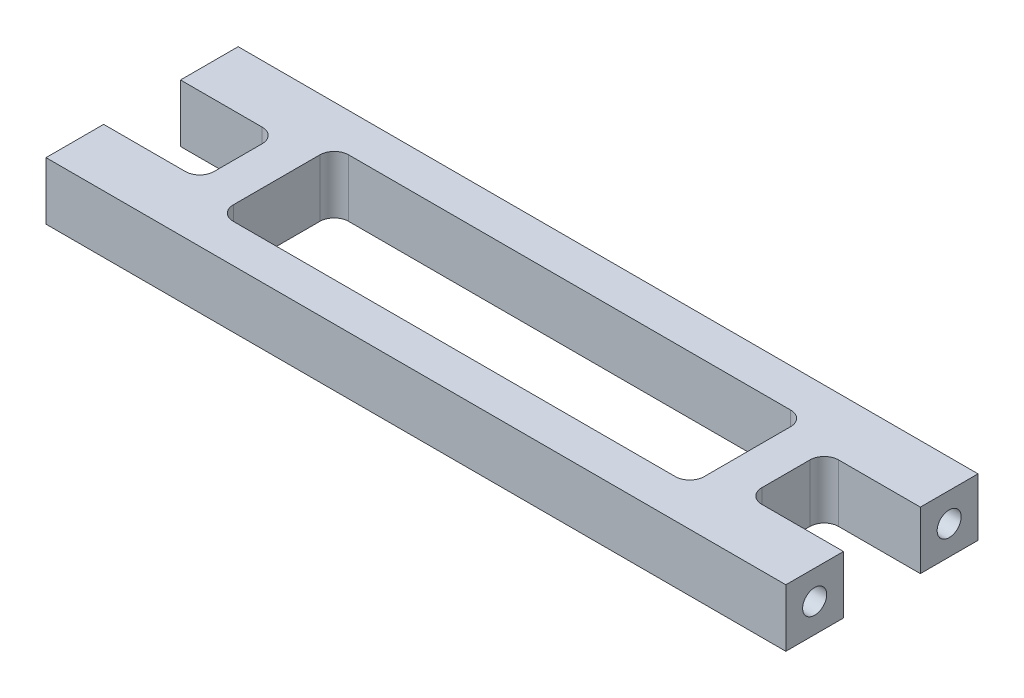
ISO-10303-21;
HEADER;
FILE_DESCRIPTION(('STEP AP214'),'2;1');
FILE_NAME('part.step','',(''),(''),'','','');
FILE_SCHEMA(('AUTOMOTIVE_DESIGN { 1 0 10303 214 1 1 1 1 }'));
ENDSEC;
DATA;
#1=APPLICATION_CONTEXT('core data for automotive mechanical design processes');
#2=APPLICATION_PROTOCOL_DEFINITION('international standard','automotive_design',2000,#1);
#3=PRODUCT_CONTEXT('',#1,'mechanical');
#4=PRODUCT('Part','Part','',(#3));
#5=PRODUCT_RELATED_PRODUCT_CATEGORY('part','',(#4));
#6=PRODUCT_DEFINITION_FORMATION('','',#4);
#7=PRODUCT_DEFINITION_CONTEXT('part definition',#1,'design');
#8=PRODUCT_DEFINITION('design','',#6,#7);
#9=PRODUCT_DEFINITION_SHAPE('','',#8);
#10=(LENGTH_UNIT() NAMED_UNIT(*) SI_UNIT(.MILLI.,.METRE.));
#11=(NAMED_UNIT(*) PLANE_ANGLE_UNIT() SI_UNIT($,.RADIAN.));
#12=(NAMED_UNIT(*) SI_UNIT($,.STERADIAN.) SOLID_ANGLE_UNIT());
#13=UNCERTAINTY_MEASURE_WITH_UNIT(LENGTH_MEASURE(1.E-05),#10,'distance_accuracy_value','');
#14=(GEOMETRIC_REPRESENTATION_CONTEXT(3) GLOBAL_UNCERTAINTY_ASSIGNED_CONTEXT((#13)) GLOBAL_UNIT_ASSIGNED_CONTEXT((#10,
#11,#12)) REPRESENTATION_CONTEXT('',''));
#15=CARTESIAN_POINT('',(0.,0.,0.));
#16=DIRECTION('',(0.,0.,1.));
#17=DIRECTION('',(1.,0.,0.));
#18=AXIS2_PLACEMENT_3D('',#15,#16,#17);
#19=CARTESIAN_POINT('',(77.,6.,0.));
#20=DIRECTION('',(-1.,0.,0.));
#21=DIRECTION('',(0.,0.,1.));
#22=AXIS2_PLACEMENT_3D('',#19,#20,#21);
#23=PLANE('',#22);
#24=CARTESIAN_POINT('',(77.,3.,-3.));
#25=DIRECTION('',(1.,0.,0.));
#26=DIRECTION('',(0.,0.,-1.));
#27=AXIS2_PLACEMENT_3D('',#24,#25,#26);
#28=CIRCLE('',#27,1.24999999999999);
#29=CARTESIAN_POINT('',(77.,3.,-4.24999999999999));
#30=VERTEX_POINT('',#29);
#31=EDGE_CURVE('E378',#30,#30,#28,.T.);
#32=ORIENTED_EDGE('',*,*,#31,.F.);
#33=EDGE_LOOP('',(#32));
#34=FACE_BOUND('',#33,.T.);
#35=DIRECTION('',(0.,0.,-1.));
#36=VECTOR('',#35,1.);
#37=CARTESIAN_POINT('',(77.,0.,0.));
#38=LINE('',#37,#36);
#39=CARTESIAN_POINT('',(77.,0.,0.));
#40=VERTEX_POINT('',#39);
#41=CARTESIAN_POINT('',(77.,0.,-6.));
#42=VERTEX_POINT('',#41);
#43=EDGE_CURVE('E213',#40,#42,#38,.T.);
#44=ORIENTED_EDGE('',*,*,#43,.T.);
#45=DIRECTION('',(0.,1.,0.));
#46=VECTOR('',#45,1.);
#47=CARTESIAN_POINT('',(77.,-0.00100000000000013,-6.));
#48=LINE('',#47,#46);
#49=CARTESIAN_POINT('',(77.,6.,-6.));
#50=VERTEX_POINT('',#49);
#51=EDGE_CURVE('E223',#42,#50,#48,.T.);
#52=ORIENTED_EDGE('',*,*,#51,.T.);
#53=DIRECTION('',(0.,0.,-1.));
#54=VECTOR('',#53,1.);
#55=CARTESIAN_POINT('',(77.,6.,0.));
#56=LINE('',#55,#54);
#57=CARTESIAN_POINT('',(77.,6.,0.));
#58=VERTEX_POINT('',#57);
#59=EDGE_CURVE('E409',#58,#50,#56,.T.);
#60=ORIENTED_EDGE('',*,*,#59,.F.);
#61=DIRECTION('',(0.,-1.,0.));
#62=VECTOR('',#61,1.);
#63=CARTESIAN_POINT('',(77.,6.,0.));
#64=LINE('',#63,#62);
#65=EDGE_CURVE('E235',#58,#40,#64,.T.);
#66=ORIENTED_EDGE('',*,*,#65,.T.);
#67=EDGE_LOOP('',(#44,#52,#60,#66));
#68=FACE_BOUND('',#67,.T.);
#69=ADVANCED_FACE('F33',(#34,#68),#23,.F.);
#70=CARTESIAN_POINT('',(0.,6.,0.));
#71=DIRECTION('',(1.,0.,0.));
#72=DIRECTION('',(0.,0.,-1.));
#73=AXIS2_PLACEMENT_3D('',#70,#71,#72);
#74=PLANE('',#73);
#75=CARTESIAN_POINT('',(0.,3.,-17.));
#76=DIRECTION('',(-1.,0.,0.));
#77=DIRECTION('',(0.,0.,1.));
#78=AXIS2_PLACEMENT_3D('',#75,#76,#77);
#79=CIRCLE('',#78,1.24999999999999);
#80=CARTESIAN_POINT('',(0.,3.,-15.75));
#81=VERTEX_POINT('',#80);
#82=EDGE_CURVE('E390',#81,#81,#79,.T.);
#83=ORIENTED_EDGE('',*,*,#82,.F.);
#84=EDGE_LOOP('',(#83));
#85=FACE_BOUND('',#84,.T.);
#86=DIRECTION('',(0.,0.,1.));
#87=VECTOR('',#86,1.);
#88=CARTESIAN_POINT('',(0.,0.,0.));
#89=LINE('',#88,#87);
#90=CARTESIAN_POINT('',(0.,0.,-20.));
#91=VERTEX_POINT('',#90);
#92=CARTESIAN_POINT('',(0.,0.,-14.));
#93=VERTEX_POINT('',#92);
#94=EDGE_CURVE('E411',#91,#93,#89,.T.);
#95=ORIENTED_EDGE('',*,*,#94,.T.);
#96=DIRECTION('',(0.,1.,0.));
#97=VECTOR('',#96,1.);
#98=CARTESIAN_POINT('',(0.,-0.00100000000000013,-14.));
#99=LINE('',#98,#97);
#100=CARTESIAN_POINT('',(0.,6.,-14.));
#101=VERTEX_POINT('',#100);
#102=EDGE_CURVE('E371',#93,#101,#99,.T.);
#103=ORIENTED_EDGE('',*,*,#102,.T.);
#104=DIRECTION('',(0.,0.,1.));
#105=VECTOR('',#104,1.);
#106=CARTESIAN_POINT('',(0.,6.,0.));
#107=LINE('',#106,#105);
#108=CARTESIAN_POINT('',(0.,6.,-20.));
#109=VERTEX_POINT('',#108);
#110=EDGE_CURVE('E403',#109,#101,#107,.T.);
#111=ORIENTED_EDGE('',*,*,#110,.F.);
#112=DIRECTION('',(0.,-1.,0.));
#113=VECTOR('',#112,1.);
#114=CARTESIAN_POINT('',(0.,6.,-20.));
#115=LINE('',#114,#113);
#116=EDGE_CURVE('E245',#109,#91,#115,.T.);
#117=ORIENTED_EDGE('',*,*,#116,.T.);
#118=EDGE_LOOP('',(#95,#103,#111,#117));
#119=FACE_BOUND('',#118,.T.);
#120=ADVANCED_FACE('F447',(#85,#119),#74,.F.);
#121=CARTESIAN_POINT('',(0.,3.,-3.));
#122=DIRECTION('',(-1.,0.,0.));
#123=DIRECTION('',(0.,0.,1.));
#124=AXIS2_PLACEMENT_3D('',#121,#122,#123);
#125=CIRCLE('',#124,1.24999999999999);
#126=CARTESIAN_POINT('',(0.,3.,-1.75000000000001));
#127=VERTEX_POINT('',#126);
#128=EDGE_CURVE('E396',#127,#127,#125,.T.);
#129=ORIENTED_EDGE('',*,*,#128,.F.);
#130=EDGE_LOOP('',(#129));
#131=FACE_BOUND('',#130,.T.);
#132=CARTESIAN_POINT('',(0.,6.,-6.));
#133=VERTEX_POINT('',#132);
#134=CARTESIAN_POINT('',(0.,6.,0.));
#135=VERTEX_POINT('',#134);
#136=EDGE_CURVE('E239',#133,#135,#107,.T.);
#137=ORIENTED_EDGE('',*,*,#136,.F.);
#138=DIRECTION('',(0.,1.,0.));
#139=VECTOR('',#138,1.);
#140=CARTESIAN_POINT('',(0.,-0.00100000000000013,-6.));
#141=LINE('',#140,#139);
#142=CARTESIAN_POINT('',(0.,0.,-6.));
#143=VERTEX_POINT('',#142);
#144=EDGE_CURVE('E370',#143,#133,#141,.T.);
#145=ORIENTED_EDGE('',*,*,#144,.F.);
#146=CARTESIAN_POINT('',(0.,0.,0.));
#147=VERTEX_POINT('',#146);
#148=EDGE_CURVE('E402',#143,#147,#89,.T.);
#149=ORIENTED_EDGE('',*,*,#148,.T.);
#150=DIRECTION('',(0.,-1.,0.));
#151=VECTOR('',#150,1.);
#152=CARTESIAN_POINT('',(0.,6.,0.));
#153=LINE('',#152,#151);
#154=EDGE_CURVE('E253',#135,#147,#153,.T.);
#155=ORIENTED_EDGE('',*,*,#154,.F.);
#156=EDGE_LOOP('',(#137,#145,#149,#155));
#157=FACE_BOUND('',#156,.T.);
#158=ADVANCED_FACE('F420',(#131,#157),#74,.F.);
#159=CARTESIAN_POINT('',(0.,6.,0.));
#160=DIRECTION('',(0.,0.,-1.));
#161=DIRECTION('',(-1.,0.,0.));
#162=AXIS2_PLACEMENT_3D('',#159,#160,#161);
#163=PLANE('',#162);
#164=DIRECTION('',(1.,0.,0.));
#165=VECTOR('',#164,1.);
#166=CARTESIAN_POINT('',(0.,0.,0.));
#167=LINE('',#166,#165);
#168=EDGE_CURVE('E241',#147,#40,#167,.T.);
#169=ORIENTED_EDGE('',*,*,#168,.T.);
#170=ORIENTED_EDGE('',*,*,#65,.F.);
#171=DIRECTION('',(1.,0.,0.));
#172=VECTOR('',#171,1.);
#173=CARTESIAN_POINT('',(0.,6.,0.));
#174=LINE('',#173,#172);
#175=EDGE_CURVE('E406',#135,#58,#174,.T.);
#176=ORIENTED_EDGE('',*,*,#175,.F.);
#177=ORIENTED_EDGE('',*,*,#154,.T.);
#178=EDGE_LOOP('',(#169,#170,#176,#177));
#179=FACE_BOUND('',#178,.T.);
#180=ADVANCED_FACE('F423',(#179),#163,.F.);
#181=CARTESIAN_POINT('',(77.,3.,-17.));
#182=DIRECTION('',(1.,0.,0.));
#183=DIRECTION('',(0.,0.,-1.));
#184=AXIS2_PLACEMENT_3D('',#181,#182,#183);
#185=CIRCLE('',#184,1.24999999999999);
#186=CARTESIAN_POINT('',(77.,3.,-18.25));
#187=VERTEX_POINT('',#186);
#188=EDGE_CURVE('E384',#187,#187,#185,.T.);
#189=ORIENTED_EDGE('',*,*,#188,.F.);
#190=EDGE_LOOP('',(#189));
#191=FACE_BOUND('',#190,.T.);
#192=CARTESIAN_POINT('',(77.,6.,-14.));
#193=VERTEX_POINT('',#192);
#194=CARTESIAN_POINT('',(77.,6.,-20.));
#195=VERTEX_POINT('',#194);
#196=EDGE_CURVE('E408',#193,#195,#56,.T.);
#197=ORIENTED_EDGE('',*,*,#196,.F.);
#198=DIRECTION('',(0.,1.,0.));
#199=VECTOR('',#198,1.);
#200=CARTESIAN_POINT('',(77.,-0.00100000000000013,-14.));
#201=LINE('',#200,#199);
#202=CARTESIAN_POINT('',(77.,0.,-14.));
#203=VERTEX_POINT('',#202);
#204=EDGE_CURVE('E231',#203,#193,#201,.T.);
#205=ORIENTED_EDGE('',*,*,#204,.F.);
#206=CARTESIAN_POINT('',(77.,0.,-20.));
#207=VERTEX_POINT('',#206);
#208=EDGE_CURVE('E237',#203,#207,#38,.T.);
#209=ORIENTED_EDGE('',*,*,#208,.T.);
#210=DIRECTION('',(0.,-1.,0.));
#211=VECTOR('',#210,1.);
#212=CARTESIAN_POINT('',(77.,6.,-20.));
#213=LINE('',#212,#211);
#214=EDGE_CURVE('E248',#195,#207,#213,.T.);
#215=ORIENTED_EDGE('',*,*,#214,.F.);
#216=EDGE_LOOP('',(#197,#205,#209,#215));
#217=FACE_BOUND('',#216,.T.);
#218=ADVANCED_FACE('F461',(#191,#217),#23,.F.);
#219=CARTESIAN_POINT('',(0.,6.,-20.));
#220=DIRECTION('',(0.,0.,1.));
#221=DIRECTION('',(1.,0.,0.));
#222=AXIS2_PLACEMENT_3D('',#219,#220,#221);
#223=PLANE('',#222);
#224=DIRECTION('',(-1.,0.,0.));
#225=VECTOR('',#224,1.);
#226=CARTESIAN_POINT('',(0.,0.,-20.));
#227=LINE('',#226,#225);
#228=EDGE_CURVE('E236',#207,#91,#227,.T.);
#229=ORIENTED_EDGE('',*,*,#228,.T.);
#230=ORIENTED_EDGE('',*,*,#116,.F.);
#231=DIRECTION('',(-1.,0.,0.));
#232=VECTOR('',#231,1.);
#233=CARTESIAN_POINT('',(0.,6.,-20.));
#234=LINE('',#233,#232);
#235=EDGE_CURVE('E249',#195,#109,#234,.T.);
#236=ORIENTED_EDGE('',*,*,#235,.F.);
#237=ORIENTED_EDGE('',*,*,#214,.T.);
#238=EDGE_LOOP('',(#229,#230,#236,#237));
#239=FACE_BOUND('',#238,.T.);
#240=ADVANCED_FACE('F454',(#239),#223,.F.);
#241=CARTESIAN_POINT('',(0.,6.,0.));
#242=DIRECTION('',(0.,-1.,0.));
#243=DIRECTION('',(0.,0.,-1.));
#244=AXIS2_PLACEMENT_3D('',#241,#242,#243);
#245=PLANE('',#244);
#246=DIRECTION('',(1.,0.,0.));
#247=VECTOR('',#246,1.);
#248=CARTESIAN_POINT('',(14.,6.,-4.));
#249=LINE('',#248,#247);
#250=CARTESIAN_POINT('',(15.5,6.,-4.));
#251=VERTEX_POINT('',#250);
#252=CARTESIAN_POINT('',(61.5,6.,-4.));
#253=VERTEX_POINT('',#252);
#254=EDGE_CURVE('E345',#251,#253,#249,.T.);
#255=ORIENTED_EDGE('',*,*,#254,.F.);
#256=CARTESIAN_POINT('',(15.5,6.,-5.5));
#257=DIRECTION('',(0.,-1.,0.));
#258=DIRECTION('',(0.,0.,-1.));
#259=AXIS2_PLACEMENT_3D('',#256,#257,#258);
#260=CIRCLE('',#259,1.5);
#261=CARTESIAN_POINT('',(14.,6.,-5.5));
#262=VERTEX_POINT('',#261);
#263=EDGE_CURVE('E305',#251,#262,#260,.T.);
#264=ORIENTED_EDGE('',*,*,#263,.T.);
#265=DIRECTION('',(0.,0.,1.));
#266=VECTOR('',#265,1.);
#267=CARTESIAN_POINT('',(14.,6.,-16.));
#268=LINE('',#267,#266);
#269=CARTESIAN_POINT('',(14.,6.,-14.5));
#270=VERTEX_POINT('',#269);
#271=EDGE_CURVE('E327',#270,#262,#268,.T.);
#272=ORIENTED_EDGE('',*,*,#271,.F.);
#273=CARTESIAN_POINT('',(15.5,6.,-14.5));
#274=DIRECTION('',(0.,-1.,0.));
#275=DIRECTION('',(0.,0.,-1.));
#276=AXIS2_PLACEMENT_3D('',#273,#274,#275);
#277=CIRCLE('',#276,1.5);
#278=CARTESIAN_POINT('',(15.5,6.,-16.));
#279=VERTEX_POINT('',#278);
#280=EDGE_CURVE('E41',#270,#279,#277,.T.);
#281=ORIENTED_EDGE('',*,*,#280,.T.);
#282=DIRECTION('',(-1.,0.,0.));
#283=VECTOR('',#282,1.);
#284=CARTESIAN_POINT('',(14.,6.,-16.));
#285=LINE('',#284,#283);
#286=CARTESIAN_POINT('',(61.5,6.,-16.));
#287=VERTEX_POINT('',#286);
#288=EDGE_CURVE('E325',#287,#279,#285,.T.);
#289=ORIENTED_EDGE('',*,*,#288,.F.);
#290=CARTESIAN_POINT('',(61.5,6.,-14.5));
#291=DIRECTION('',(0.,-1.,0.));
#292=DIRECTION('',(0.,0.,-1.));
#293=AXIS2_PLACEMENT_3D('',#290,#291,#292);
#294=CIRCLE('',#293,1.5);
#295=CARTESIAN_POINT('',(63.,6.,-14.5));
#296=VERTEX_POINT('',#295);
#297=EDGE_CURVE('E317',#287,#296,#294,.T.);
#298=ORIENTED_EDGE('',*,*,#297,.T.);
#299=DIRECTION('',(0.,0.,-1.));
#300=VECTOR('',#299,1.);
#301=CARTESIAN_POINT('',(63.,6.,-16.));
#302=LINE('',#301,#300);
#303=CARTESIAN_POINT('',(63.,6.,-5.5));
#304=VERTEX_POINT('',#303);
#305=EDGE_CURVE('E333',#304,#296,#302,.T.);
#306=ORIENTED_EDGE('',*,*,#305,.F.);
#307=CARTESIAN_POINT('',(61.5,6.,-5.5));
#308=DIRECTION('',(0.,-1.,0.));
#309=DIRECTION('',(0.,0.,-1.));
#310=AXIS2_PLACEMENT_3D('',#307,#308,#309);
#311=CIRCLE('',#310,1.5);
#312=EDGE_CURVE('E301',#304,#253,#311,.T.);
#313=ORIENTED_EDGE('',*,*,#312,.T.);
#314=EDGE_LOOP('',(#255,#264,#272,#281,#289,#298,#306,#313));
#315=FACE_BOUND('',#314,.T.);
#316=ORIENTED_EDGE('',*,*,#59,.T.);
#317=DIRECTION('',(1.,0.,0.));
#318=VECTOR('',#317,1.);
#319=CARTESIAN_POINT('',(77.,6.,-6.));
#320=LINE('',#319,#318);
#321=CARTESIAN_POINT('',(68.5,6.,-6.));
#322=VERTEX_POINT('',#321);
#323=EDGE_CURVE('E226',#322,#50,#320,.T.);
#324=ORIENTED_EDGE('',*,*,#323,.F.);
#325=CARTESIAN_POINT('',(68.5,6.,-7.5));
#326=DIRECTION('',(0.,-1.,0.));
#327=DIRECTION('',(0.,0.,-1.));
#328=AXIS2_PLACEMENT_3D('',#325,#326,#327);
#329=CIRCLE('',#328,1.5);
#330=CARTESIAN_POINT('',(67.,6.,-7.5));
#331=VERTEX_POINT('',#330);
#332=EDGE_CURVE('E294',#322,#331,#329,.T.);
#333=ORIENTED_EDGE('',*,*,#332,.T.);
#334=DIRECTION('',(0.,0.,1.));
#335=VECTOR('',#334,1.);
#336=CARTESIAN_POINT('',(67.,6.,-14.));
#337=LINE('',#336,#335);
#338=CARTESIAN_POINT('',(67.,6.,-12.5));
#339=VERTEX_POINT('',#338);
#340=EDGE_CURVE('E465',#339,#331,#337,.T.);
#341=ORIENTED_EDGE('',*,*,#340,.F.);
#342=CARTESIAN_POINT('',(68.5,6.,-12.5));
#343=DIRECTION('',(0.,-1.,0.));
#344=DIRECTION('',(0.,0.,-1.));
#345=AXIS2_PLACEMENT_3D('',#342,#343,#344);
#346=CIRCLE('',#345,1.5);
#347=CARTESIAN_POINT('',(68.5,6.,-14.));
#348=VERTEX_POINT('',#347);
#349=EDGE_CURVE('E297',#339,#348,#346,.T.);
#350=ORIENTED_EDGE('',*,*,#349,.T.);
#351=DIRECTION('',(-1.,0.,0.));
#352=VECTOR('',#351,1.);
#353=CARTESIAN_POINT('',(77.,6.,-14.));
#354=LINE('',#353,#352);
#355=EDGE_CURVE('E219',#193,#348,#354,.T.);
#356=ORIENTED_EDGE('',*,*,#355,.F.);
#357=ORIENTED_EDGE('',*,*,#196,.T.);
#358=ORIENTED_EDGE('',*,*,#235,.T.);
#359=ORIENTED_EDGE('',*,*,#110,.T.);
#360=DIRECTION('',(-1.,0.,0.));
#361=VECTOR('',#360,1.);
#362=CARTESIAN_POINT('',(0.,6.,-14.));
#363=LINE('',#362,#361);
#364=CARTESIAN_POINT('',(8.5,6.,-14.));
#365=VERTEX_POINT('',#364);
#366=EDGE_CURVE('E368',#365,#101,#363,.T.);
#367=ORIENTED_EDGE('',*,*,#366,.F.);
#368=CARTESIAN_POINT('',(8.5,6.,-12.5));
#369=DIRECTION('',(0.,-1.,0.));
#370=DIRECTION('',(0.,0.,-1.));
#371=AXIS2_PLACEMENT_3D('',#368,#369,#370);
#372=CIRCLE('',#371,1.5);
#373=CARTESIAN_POINT('',(10.,6.,-12.5));
#374=VERTEX_POINT('',#373);
#375=EDGE_CURVE('E313',#365,#374,#372,.T.);
#376=ORIENTED_EDGE('',*,*,#375,.T.);
#377=DIRECTION('',(0.,0.,-1.));
#378=VECTOR('',#377,1.);
#379=CARTESIAN_POINT('',(10.,6.,-14.));
#380=LINE('',#379,#378);
#381=CARTESIAN_POINT('',(10.,6.,-7.5));
#382=VERTEX_POINT('',#381);
#383=EDGE_CURVE('E365',#382,#374,#380,.T.);
#384=ORIENTED_EDGE('',*,*,#383,.F.);
#385=CARTESIAN_POINT('',(8.5,6.,-7.5));
#386=DIRECTION('',(0.,-1.,0.));
#387=DIRECTION('',(0.,0.,-1.));
#388=AXIS2_PLACEMENT_3D('',#385,#386,#387);
#389=CIRCLE('',#388,1.5);
#390=CARTESIAN_POINT('',(8.5,6.,-6.));
#391=VERTEX_POINT('',#390);
#392=EDGE_CURVE('E309',#382,#391,#389,.T.);
#393=ORIENTED_EDGE('',*,*,#392,.T.);
#394=DIRECTION('',(1.,0.,0.));
#395=VECTOR('',#394,1.);
#396=CARTESIAN_POINT('',(0.,6.,-6.));
#397=LINE('',#396,#395);
#398=EDGE_CURVE('E362',#133,#391,#397,.T.);
#399=ORIENTED_EDGE('',*,*,#398,.F.);
#400=ORIENTED_EDGE('',*,*,#136,.T.);
#401=ORIENTED_EDGE('',*,*,#175,.T.);
#402=EDGE_LOOP('',(#316,#324,#333,#341,#350,#356,#357,#358,#359,#367,#376,#384,#393,#399,#400,#401));
#403=FACE_BOUND('',#402,.T.);
#404=ADVANCED_FACE('F323',(#315,#403),#245,.F.);
#405=CARTESIAN_POINT('',(0.,0.,0.));
#406=DIRECTION('',(0.,-1.,0.));
#407=DIRECTION('',(0.,0.,-1.));
#408=AXIS2_PLACEMENT_3D('',#405,#406,#407);
#409=PLANE('',#408);
#410=DIRECTION('',(0.,0.,1.));
#411=VECTOR('',#410,1.);
#412=CARTESIAN_POINT('',(67.,0.,-14.));
#413=LINE('',#412,#411);
#414=CARTESIAN_POINT('',(67.,0.,-12.5));
#415=VERTEX_POINT('',#414);
#416=CARTESIAN_POINT('',(67.,0.,-7.5));
#417=VERTEX_POINT('',#416);
#418=EDGE_CURVE('E220',#415,#417,#413,.T.);
#419=ORIENTED_EDGE('',*,*,#418,.T.);
#420=CARTESIAN_POINT('',(68.5,0.,-7.5));
#421=DIRECTION('',(0.,-1.,0.));
#422=DIRECTION('',(0.,0.,-1.));
#423=AXIS2_PLACEMENT_3D('',#420,#421,#422);
#424=CIRCLE('',#423,1.5);
#425=CARTESIAN_POINT('',(68.5,0.,-6.));
#426=VERTEX_POINT('',#425);
#427=EDGE_CURVE('E215',#417,#426,#424,.F.);
#428=ORIENTED_EDGE('',*,*,#427,.T.);
#429=DIRECTION('',(1.,0.,0.));
#430=VECTOR('',#429,1.);
#431=CARTESIAN_POINT('',(77.,0.,-6.));
#432=LINE('',#431,#430);
#433=EDGE_CURVE('E207',#426,#42,#432,.T.);
#434=ORIENTED_EDGE('',*,*,#433,.T.);
#435=ORIENTED_EDGE('',*,*,#43,.F.);
#436=ORIENTED_EDGE('',*,*,#168,.F.);
#437=ORIENTED_EDGE('',*,*,#148,.F.);
#438=DIRECTION('',(1.,0.,0.));
#439=VECTOR('',#438,1.);
#440=CARTESIAN_POINT('',(0.,0.,-6.));
#441=LINE('',#440,#439);
#442=CARTESIAN_POINT('',(8.5,0.,-6.));
#443=VERTEX_POINT('',#442);
#444=EDGE_CURVE('E374',#143,#443,#441,.T.);
#445=ORIENTED_EDGE('',*,*,#444,.T.);
#446=CARTESIAN_POINT('',(8.5,0.,-7.5));
#447=DIRECTION('',(0.,-1.,0.));
#448=DIRECTION('',(0.,0.,-1.));
#449=AXIS2_PLACEMENT_3D('',#446,#447,#448);
#450=CIRCLE('',#449,1.5);
#451=CARTESIAN_POINT('',(10.,0.,-7.5));
#452=VERTEX_POINT('',#451);
#453=EDGE_CURVE('E311',#443,#452,#450,.F.);
#454=ORIENTED_EDGE('',*,*,#453,.T.);
#455=DIRECTION('',(0.,0.,-1.));
#456=VECTOR('',#455,1.);
#457=CARTESIAN_POINT('',(10.,0.,-14.));
#458=LINE('',#457,#456);
#459=CARTESIAN_POINT('',(10.,0.,-12.5));
#460=VERTEX_POINT('',#459);
#461=EDGE_CURVE('E357',#452,#460,#458,.T.);
#462=ORIENTED_EDGE('',*,*,#461,.T.);
#463=CARTESIAN_POINT('',(8.5,0.,-12.5));
#464=DIRECTION('',(0.,-1.,0.));
#465=DIRECTION('',(0.,0.,-1.));
#466=AXIS2_PLACEMENT_3D('',#463,#464,#465);
#467=CIRCLE('',#466,1.5);
#468=CARTESIAN_POINT('',(8.5,0.,-14.));
#469=VERTEX_POINT('',#468);
#470=EDGE_CURVE('E315',#460,#469,#467,.F.);
#471=ORIENTED_EDGE('',*,*,#470,.T.);
#472=DIRECTION('',(-1.,0.,0.));
#473=VECTOR('',#472,1.);
#474=CARTESIAN_POINT('',(0.,0.,-14.));
#475=LINE('',#474,#473);
#476=EDGE_CURVE('E360',#469,#93,#475,.T.);
#477=ORIENTED_EDGE('',*,*,#476,.T.);
#478=ORIENTED_EDGE('',*,*,#94,.F.);
#479=ORIENTED_EDGE('',*,*,#228,.F.);
#480=ORIENTED_EDGE('',*,*,#208,.F.);
#481=DIRECTION('',(-1.,0.,0.));
#482=VECTOR('',#481,1.);
#483=CARTESIAN_POINT('',(77.,0.,-14.));
#484=LINE('',#483,#482);
#485=CARTESIAN_POINT('',(68.5,0.,-14.));
#486=VERTEX_POINT('',#485);
#487=EDGE_CURVE('E230',#203,#486,#484,.T.);
#488=ORIENTED_EDGE('',*,*,#487,.T.);
#489=CARTESIAN_POINT('',(68.5,0.,-12.5));
#490=DIRECTION('',(0.,-1.,0.));
#491=DIRECTION('',(0.,0.,-1.));
#492=AXIS2_PLACEMENT_3D('',#489,#490,#491);
#493=CIRCLE('',#492,1.5);
#494=EDGE_CURVE('E299',#486,#415,#493,.F.);
#495=ORIENTED_EDGE('',*,*,#494,.T.);
#496=EDGE_LOOP('',(#419,#428,#434,#435,#436,#437,#445,#454,#462,#471,#477,#478,#479,#480,#488,#495));
#497=FACE_BOUND('',#496,.T.);
#498=DIRECTION('',(-1.,0.,0.));
#499=VECTOR('',#498,1.);
#500=CARTESIAN_POINT('',(14.,0.,-16.));
#501=LINE('',#500,#499);
#502=CARTESIAN_POINT('',(61.5,0.,-16.));
#503=VERTEX_POINT('',#502);
#504=CARTESIAN_POINT('',(15.5,0.,-16.));
#505=VERTEX_POINT('',#504);
#506=EDGE_CURVE('E340',#503,#505,#501,.T.);
#507=ORIENTED_EDGE('',*,*,#506,.T.);
#508=CARTESIAN_POINT('',(15.5,0.,-14.5));
#509=DIRECTION('',(0.,-1.,0.));
#510=DIRECTION('',(0.,0.,-1.));
#511=AXIS2_PLACEMENT_3D('',#508,#509,#510);
#512=CIRCLE('',#511,1.5);
#513=CARTESIAN_POINT('',(14.,0.,-14.5));
#514=VERTEX_POINT('',#513);
#515=EDGE_CURVE('E11',#505,#514,#512,.F.);
#516=ORIENTED_EDGE('',*,*,#515,.T.);
#517=DIRECTION('',(0.,0.,1.));
#518=VECTOR('',#517,1.);
#519=CARTESIAN_POINT('',(14.,0.,-16.));
#520=LINE('',#519,#518);
#521=CARTESIAN_POINT('',(14.,0.,-5.5));
#522=VERTEX_POINT('',#521);
#523=EDGE_CURVE('E338',#514,#522,#520,.T.);
#524=ORIENTED_EDGE('',*,*,#523,.T.);
#525=CARTESIAN_POINT('',(15.5,0.,-5.5));
#526=DIRECTION('',(0.,-1.,0.));
#527=DIRECTION('',(0.,0.,-1.));
#528=AXIS2_PLACEMENT_3D('',#525,#526,#527);
#529=CIRCLE('',#528,1.5);
#530=CARTESIAN_POINT('',(15.5,0.,-4.));
#531=VERTEX_POINT('',#530);
#532=EDGE_CURVE('E307',#522,#531,#529,.F.);
#533=ORIENTED_EDGE('',*,*,#532,.T.);
#534=DIRECTION('',(1.,0.,0.));
#535=VECTOR('',#534,1.);
#536=CARTESIAN_POINT('',(14.,0.,-4.));
#537=LINE('',#536,#535);
#538=CARTESIAN_POINT('',(61.5,0.,-4.));
#539=VERTEX_POINT('',#538);
#540=EDGE_CURVE('E332',#531,#539,#537,.T.);
#541=ORIENTED_EDGE('',*,*,#540,.T.);
#542=CARTESIAN_POINT('',(61.5,0.,-5.5));
#543=DIRECTION('',(0.,-1.,0.));
#544=DIRECTION('',(0.,0.,-1.));
#545=AXIS2_PLACEMENT_3D('',#542,#543,#544);
#546=CIRCLE('',#545,1.5);
#547=CARTESIAN_POINT('',(63.,0.,-5.5));
#548=VERTEX_POINT('',#547);
#549=EDGE_CURVE('E303',#539,#548,#546,.F.);
#550=ORIENTED_EDGE('',*,*,#549,.T.);
#551=DIRECTION('',(0.,0.,-1.));
#552=VECTOR('',#551,1.);
#553=CARTESIAN_POINT('',(63.,0.,-16.));
#554=LINE('',#553,#552);
#555=CARTESIAN_POINT('',(63.,0.,-14.5));
#556=VERTEX_POINT('',#555);
#557=EDGE_CURVE('E347',#548,#556,#554,.T.);
#558=ORIENTED_EDGE('',*,*,#557,.T.);
#559=CARTESIAN_POINT('',(61.5,0.,-14.5));
#560=DIRECTION('',(0.,-1.,0.));
#561=DIRECTION('',(0.,0.,-1.));
#562=AXIS2_PLACEMENT_3D('',#559,#560,#561);
#563=CIRCLE('',#562,1.5);
#564=EDGE_CURVE('E55',#556,#503,#563,.F.);
#565=ORIENTED_EDGE('',*,*,#564,.T.);
#566=EDGE_LOOP('',(#507,#516,#524,#533,#541,#550,#558,#565));
#567=FACE_BOUND('',#566,.T.);
#568=ADVANCED_FACE('F210',(#497,#567),#409,.T.);
#569=CARTESIAN_POINT('',(9.99999999999999,3.,-3.));
#570=DIRECTION('',(-1.,0.,0.));
#571=DIRECTION('',(0.,0.,1.));
#572=AXIS2_PLACEMENT_3D('',#569,#570,#571);
#573=CONICAL_SURFACE('',#572,1.24999999999999,1.02974425867665);
#574=CARTESIAN_POINT('',(10.7510757737844,3.,-3.));
#575=VERTEX_POINT('',#574);
#576=VERTEX_LOOP('',#575);
#577=FACE_BOUND('',#576,.T.);
#578=CARTESIAN_POINT('',(9.99999999999999,3.,-3.));
#579=DIRECTION('',(-1.,0.,0.));
#580=DIRECTION('',(0.,0.,1.));
#581=AXIS2_PLACEMENT_3D('',#578,#579,#580);
#582=CIRCLE('',#581,1.24999999999999);
#583=CARTESIAN_POINT('',(9.99999999999999,3.,-1.75000000000001));
#584=VERTEX_POINT('',#583);
#585=EDGE_CURVE('E399',#584,#584,#582,.T.);
#586=ORIENTED_EDGE('',*,*,#585,.T.);
#587=EDGE_LOOP('',(#586));
#588=FACE_BOUND('',#587,.T.);
#589=ADVANCED_FACE('F546',(#577,#588),#573,.F.);
#590=CARTESIAN_POINT('',(0.,3.,-3.));
#591=DIRECTION('',(-1.,0.,0.));
#592=DIRECTION('',(0.,0.,1.));
#593=AXIS2_PLACEMENT_3D('',#590,#591,#592);
#594=CYLINDRICAL_SURFACE('',#593,1.24999999999999);
#595=ORIENTED_EDGE('',*,*,#585,.F.);
#596=EDGE_LOOP('',(#595));
#597=FACE_BOUND('',#596,.T.);
#598=ORIENTED_EDGE('',*,*,#128,.T.);
#599=EDGE_LOOP('',(#598));
#600=FACE_BOUND('',#599,.T.);
#601=ADVANCED_FACE('F542',(#597,#600),#594,.F.);
#602=CARTESIAN_POINT('',(9.99999999999999,3.,-17.));
#603=DIRECTION('',(-1.,0.,0.));
#604=DIRECTION('',(0.,0.,1.));
#605=AXIS2_PLACEMENT_3D('',#602,#603,#604);
#606=CONICAL_SURFACE('',#605,1.24999999999999,1.02974425867665);
#607=CARTESIAN_POINT('',(10.7510757737844,3.,-17.));
#608=VERTEX_POINT('',#607);
#609=VERTEX_LOOP('',#608);
#610=FACE_BOUND('',#609,.T.);
#611=CARTESIAN_POINT('',(9.99999999999999,3.,-17.));
#612=DIRECTION('',(-1.,0.,0.));
#613=DIRECTION('',(0.,0.,1.));
#614=AXIS2_PLACEMENT_3D('',#611,#612,#613);
#615=CIRCLE('',#614,1.24999999999999);
#616=CARTESIAN_POINT('',(9.99999999999999,3.,-15.75));
#617=VERTEX_POINT('',#616);
#618=EDGE_CURVE('E393',#617,#617,#615,.T.);
#619=ORIENTED_EDGE('',*,*,#618,.T.);
#620=EDGE_LOOP('',(#619));
#621=FACE_BOUND('',#620,.T.);
#622=ADVANCED_FACE('F538',(#610,#621),#606,.F.);
#623=CARTESIAN_POINT('',(0.,3.,-17.));
#624=DIRECTION('',(-1.,0.,0.));
#625=DIRECTION('',(0.,0.,1.));
#626=AXIS2_PLACEMENT_3D('',#623,#624,#625);
#627=CYLINDRICAL_SURFACE('',#626,1.24999999999999);
#628=ORIENTED_EDGE('',*,*,#618,.F.);
#629=EDGE_LOOP('',(#628));
#630=FACE_BOUND('',#629,.T.);
#631=ORIENTED_EDGE('',*,*,#82,.T.);
#632=EDGE_LOOP('',(#631));
#633=FACE_BOUND('',#632,.T.);
#634=ADVANCED_FACE('F530',(#630,#633),#627,.F.);
#635=CARTESIAN_POINT('',(67.,3.,-17.));
#636=DIRECTION('',(1.,0.,0.));
#637=DIRECTION('',(0.,0.,-1.));
#638=AXIS2_PLACEMENT_3D('',#635,#636,#637);
#639=CONICAL_SURFACE('',#638,1.24999999999999,1.02974425867665);
#640=CARTESIAN_POINT('',(66.2489242262155,3.,-17.));
#641=VERTEX_POINT('',#640);
#642=VERTEX_LOOP('',#641);
#643=FACE_BOUND('',#642,.T.);
#644=CARTESIAN_POINT('',(67.,3.,-17.));
#645=DIRECTION('',(1.,0.,0.));
#646=DIRECTION('',(0.,0.,-1.));
#647=AXIS2_PLACEMENT_3D('',#644,#645,#646);
#648=CIRCLE('',#647,1.24999999999999);
#649=CARTESIAN_POINT('',(67.,3.,-18.25));
#650=VERTEX_POINT('',#649);
#651=EDGE_CURVE('E387',#650,#650,#648,.T.);
#652=ORIENTED_EDGE('',*,*,#651,.T.);
#653=EDGE_LOOP('',(#652));
#654=FACE_BOUND('',#653,.T.);
#655=ADVANCED_FACE('F520',(#643,#654),#639,.F.);
#656=CARTESIAN_POINT('',(77.,3.,-17.));
#657=DIRECTION('',(1.,0.,0.));
#658=DIRECTION('',(0.,0.,-1.));
#659=AXIS2_PLACEMENT_3D('',#656,#657,#658);
#660=CYLINDRICAL_SURFACE('',#659,1.24999999999999);
#661=ORIENTED_EDGE('',*,*,#651,.F.);
#662=EDGE_LOOP('',(#661));
#663=FACE_BOUND('',#662,.T.);
#664=ORIENTED_EDGE('',*,*,#188,.T.);
#665=EDGE_LOOP('',(#664));
#666=FACE_BOUND('',#665,.T.);
#667=ADVANCED_FACE('F517',(#663,#666),#660,.F.);
#668=CARTESIAN_POINT('',(67.,3.,-3.));
#669=DIRECTION('',(1.,0.,0.));
#670=DIRECTION('',(0.,0.,-1.));
#671=AXIS2_PLACEMENT_3D('',#668,#669,#670);
#672=CONICAL_SURFACE('',#671,1.24999999999999,1.02974425867665);
#673=CARTESIAN_POINT('',(66.2489242262155,3.,-3.));
#674=VERTEX_POINT('',#673);
#675=VERTEX_LOOP('',#674);
#676=FACE_BOUND('',#675,.T.);
#677=CARTESIAN_POINT('',(67.,3.,-3.));
#678=DIRECTION('',(1.,0.,0.));
#679=DIRECTION('',(0.,0.,-1.));
#680=AXIS2_PLACEMENT_3D('',#677,#678,#679);
#681=CIRCLE('',#680,1.24999999999999);
#682=CARTESIAN_POINT('',(67.,3.,-4.24999999999999));
#683=VERTEX_POINT('',#682);
#684=EDGE_CURVE('E381',#683,#683,#681,.T.);
#685=ORIENTED_EDGE('',*,*,#684,.T.);
#686=EDGE_LOOP('',(#685));
#687=FACE_BOUND('',#686,.T.);
#688=ADVANCED_FACE('F519',(#676,#687),#672,.F.);
#689=CARTESIAN_POINT('',(77.,3.,-3.));
#690=DIRECTION('',(1.,0.,0.));
#691=DIRECTION('',(0.,0.,-1.));
#692=AXIS2_PLACEMENT_3D('',#689,#690,#691);
#693=CYLINDRICAL_SURFACE('',#692,1.24999999999999);
#694=ORIENTED_EDGE('',*,*,#684,.F.);
#695=EDGE_LOOP('',(#694));
#696=FACE_BOUND('',#695,.T.);
#697=ORIENTED_EDGE('',*,*,#31,.T.);
#698=EDGE_LOOP('',(#697));
#699=FACE_BOUND('',#698,.T.);
#700=ADVANCED_FACE('F527',(#696,#699),#693,.F.);
#701=CARTESIAN_POINT('',(0.,-0.00100000000000013,-14.));
#702=DIRECTION('',(0.,0.,-1.));
#703=DIRECTION('',(-1.,0.,0.));
#704=AXIS2_PLACEMENT_3D('',#701,#702,#703);
#705=PLANE('',#704);
#706=ORIENTED_EDGE('',*,*,#476,.F.);
#707=DIRECTION('',(0.,1.,0.));
#708=VECTOR('',#707,1.);
#709=CARTESIAN_POINT('',(8.5,6.,-14.));
#710=LINE('',#709,#708);
#711=EDGE_CURVE('E287',#469,#365,#710,.T.);
#712=ORIENTED_EDGE('',*,*,#711,.T.);
#713=ORIENTED_EDGE('',*,*,#366,.T.);
#714=ORIENTED_EDGE('',*,*,#102,.F.);
#715=EDGE_LOOP('',(#706,#712,#713,#714));
#716=FACE_BOUND('',#715,.T.);
#717=ADVANCED_FACE('F444',(#716),#705,.F.);
#718=CARTESIAN_POINT('',(10.,-0.00100000000000013,-14.));
#719=DIRECTION('',(1.,0.,0.));
#720=DIRECTION('',(0.,0.,-1.));
#721=AXIS2_PLACEMENT_3D('',#718,#719,#720);
#722=PLANE('',#721);
#723=ORIENTED_EDGE('',*,*,#461,.F.);
#724=DIRECTION('',(0.,1.,0.));
#725=VECTOR('',#724,1.);
#726=CARTESIAN_POINT('',(10.,6.,-7.5));
#727=LINE('',#726,#725);
#728=EDGE_CURVE('E282',#452,#382,#727,.T.);
#729=ORIENTED_EDGE('',*,*,#728,.T.);
#730=ORIENTED_EDGE('',*,*,#383,.T.);
#731=DIRECTION('',(0.,1.,0.));
#732=VECTOR('',#731,1.);
#733=CARTESIAN_POINT('',(10.,0.,-12.5));
#734=LINE('',#733,#732);
#735=EDGE_CURVE('E280',#374,#460,#734,.F.);
#736=ORIENTED_EDGE('',*,*,#735,.T.);
#737=EDGE_LOOP('',(#723,#729,#730,#736));
#738=FACE_BOUND('',#737,.T.);
#739=ADVANCED_FACE('F436',(#738),#722,.F.);
#740=CARTESIAN_POINT('',(0.,-0.00100000000000013,-6.));
#741=DIRECTION('',(0.,0.,1.));
#742=DIRECTION('',(1.,0.,0.));
#743=AXIS2_PLACEMENT_3D('',#740,#741,#742);
#744=PLANE('',#743);
#745=ORIENTED_EDGE('',*,*,#398,.T.);
#746=DIRECTION('',(0.,1.,0.));
#747=VECTOR('',#746,1.);
#748=CARTESIAN_POINT('',(8.5,0.,-6.));
#749=LINE('',#748,#747);
#750=EDGE_CURVE('E285',#391,#443,#749,.F.);
#751=ORIENTED_EDGE('',*,*,#750,.T.);
#752=ORIENTED_EDGE('',*,*,#444,.F.);
#753=ORIENTED_EDGE('',*,*,#144,.T.);
#754=EDGE_LOOP('',(#745,#751,#752,#753));
#755=FACE_BOUND('',#754,.T.);
#756=ADVANCED_FACE('F428',(#755),#744,.F.);
#757=CARTESIAN_POINT('',(14.,-0.00100000000000013,-16.));
#758=DIRECTION('',(-1.,0.,0.));
#759=DIRECTION('',(0.,0.,1.));
#760=AXIS2_PLACEMENT_3D('',#757,#758,#759);
#761=PLANE('',#760);
#762=ORIENTED_EDGE('',*,*,#271,.T.);
#763=DIRECTION('',(0.,1.,0.));
#764=VECTOR('',#763,1.);
#765=CARTESIAN_POINT('',(14.,0.,-5.5));
#766=LINE('',#765,#764);
#767=EDGE_CURVE('E278',#262,#522,#766,.F.);
#768=ORIENTED_EDGE('',*,*,#767,.T.);
#769=ORIENTED_EDGE('',*,*,#523,.F.);
#770=DIRECTION('',(0.,1.,0.));
#771=VECTOR('',#770,1.);
#772=CARTESIAN_POINT('',(14.,6.,-14.5));
#773=LINE('',#772,#771);
#774=EDGE_CURVE('E275',#514,#270,#773,.T.);
#775=ORIENTED_EDGE('',*,*,#774,.T.);
#776=EDGE_LOOP('',(#762,#768,#769,#775));
#777=FACE_BOUND('',#776,.T.);
#778=ADVANCED_FACE('F342',(#777),#761,.F.);
#779=CARTESIAN_POINT('',(14.,-0.00100000000000013,-16.));
#780=DIRECTION('',(0.,0.,-1.));
#781=DIRECTION('',(-1.,0.,0.));
#782=AXIS2_PLACEMENT_3D('',#779,#780,#781);
#783=PLANE('',#782);
#784=ORIENTED_EDGE('',*,*,#506,.F.);
#785=DIRECTION('',(0.,1.,0.));
#786=VECTOR('',#785,1.);
#787=CARTESIAN_POINT('',(61.5,6.,-16.));
#788=LINE('',#787,#786);
#789=EDGE_CURVE('E291',#503,#287,#788,.T.);
#790=ORIENTED_EDGE('',*,*,#789,.T.);
#791=ORIENTED_EDGE('',*,*,#288,.T.);
#792=DIRECTION('',(0.,1.,0.));
#793=VECTOR('',#792,1.);
#794=CARTESIAN_POINT('',(15.5,0.,-16.));
#795=LINE('',#794,#793);
#796=EDGE_CURVE('E48',#279,#505,#795,.F.);
#797=ORIENTED_EDGE('',*,*,#796,.T.);
#798=EDGE_LOOP('',(#784,#790,#791,#797));
#799=FACE_BOUND('',#798,.T.);
#800=ADVANCED_FACE('F330',(#799),#783,.F.);
#801=CARTESIAN_POINT('',(63.,-0.00100000000000013,-16.));
#802=DIRECTION('',(1.,0.,0.));
#803=DIRECTION('',(0.,0.,-1.));
#804=AXIS2_PLACEMENT_3D('',#801,#802,#803);
#805=PLANE('',#804);
#806=ORIENTED_EDGE('',*,*,#557,.F.);
#807=DIRECTION('',(0.,1.,0.));
#808=VECTOR('',#807,1.);
#809=CARTESIAN_POINT('',(63.,6.,-5.5));
#810=LINE('',#809,#808);
#811=EDGE_CURVE('E267',#548,#304,#810,.T.);
#812=ORIENTED_EDGE('',*,*,#811,.T.);
#813=ORIENTED_EDGE('',*,*,#305,.T.);
#814=DIRECTION('',(0.,1.,0.));
#815=VECTOR('',#814,1.);
#816=CARTESIAN_POINT('',(63.,0.,-14.5));
#817=LINE('',#816,#815);
#818=EDGE_CURVE('E265',#296,#556,#817,.F.);
#819=ORIENTED_EDGE('',*,*,#818,.T.);
#820=EDGE_LOOP('',(#806,#812,#813,#819));
#821=FACE_BOUND('',#820,.T.);
#822=ADVANCED_FACE('F476',(#821),#805,.F.);
#823=CARTESIAN_POINT('',(14.,-0.00100000000000013,-4.));
#824=DIRECTION('',(0.,0.,1.));
#825=DIRECTION('',(1.,0.,0.));
#826=AXIS2_PLACEMENT_3D('',#823,#824,#825);
#827=PLANE('',#826);
#828=ORIENTED_EDGE('',*,*,#254,.T.);
#829=DIRECTION('',(0.,1.,0.));
#830=VECTOR('',#829,1.);
#831=CARTESIAN_POINT('',(61.5,0.,-4.));
#832=LINE('',#831,#830);
#833=EDGE_CURVE('E273',#253,#539,#832,.F.);
#834=ORIENTED_EDGE('',*,*,#833,.T.);
#835=ORIENTED_EDGE('',*,*,#540,.F.);
#836=DIRECTION('',(0.,1.,0.));
#837=VECTOR('',#836,1.);
#838=CARTESIAN_POINT('',(15.5,6.,-4.));
#839=LINE('',#838,#837);
#840=EDGE_CURVE('E270',#531,#251,#839,.T.);
#841=ORIENTED_EDGE('',*,*,#840,.T.);
#842=EDGE_LOOP('',(#828,#834,#835,#841));
#843=FACE_BOUND('',#842,.T.);
#844=ADVANCED_FACE('F481',(#843),#827,.F.);
#845=CARTESIAN_POINT('',(77.,-0.00100000000000013,-6.));
#846=DIRECTION('',(0.,0.,1.));
#847=DIRECTION('',(1.,0.,0.));
#848=AXIS2_PLACEMENT_3D('',#845,#846,#847);
#849=PLANE('',#848);
#850=ORIENTED_EDGE('',*,*,#433,.F.);
#851=DIRECTION('',(0.,1.,0.));
#852=VECTOR('',#851,1.);
#853=CARTESIAN_POINT('',(68.5,6.,-6.));
#854=LINE('',#853,#852);
#855=EDGE_CURVE('E256',#426,#322,#854,.T.);
#856=ORIENTED_EDGE('',*,*,#855,.T.);
#857=ORIENTED_EDGE('',*,*,#323,.T.);
#858=ORIENTED_EDGE('',*,*,#51,.F.);
#859=EDGE_LOOP('',(#850,#856,#857,#858));
#860=FACE_BOUND('',#859,.T.);
#861=ADVANCED_FACE('F224',(#860),#849,.F.);
#862=CARTESIAN_POINT('',(67.,-0.00100000000000013,-14.));
#863=DIRECTION('',(-1.,0.,0.));
#864=DIRECTION('',(0.,0.,1.));
#865=AXIS2_PLACEMENT_3D('',#862,#863,#864);
#866=PLANE('',#865);
#867=ORIENTED_EDGE('',*,*,#340,.T.);
#868=DIRECTION('',(0.,1.,0.));
#869=VECTOR('',#868,1.);
#870=CARTESIAN_POINT('',(67.,0.,-7.5));
#871=LINE('',#870,#869);
#872=EDGE_CURVE('E261',#331,#417,#871,.F.);
#873=ORIENTED_EDGE('',*,*,#872,.T.);
#874=ORIENTED_EDGE('',*,*,#418,.F.);
#875=DIRECTION('',(0.,1.,0.));
#876=VECTOR('',#875,1.);
#877=CARTESIAN_POINT('',(67.,6.,-12.5));
#878=LINE('',#877,#876);
#879=EDGE_CURVE('E258',#415,#339,#878,.T.);
#880=ORIENTED_EDGE('',*,*,#879,.T.);
#881=EDGE_LOOP('',(#867,#873,#874,#880));
#882=FACE_BOUND('',#881,.T.);
#883=ADVANCED_FACE('F621',(#882),#866,.F.);
#884=CARTESIAN_POINT('',(77.,-0.00100000000000013,-14.));
#885=DIRECTION('',(0.,0.,-1.));
#886=DIRECTION('',(-1.,0.,0.));
#887=AXIS2_PLACEMENT_3D('',#884,#885,#886);
#888=PLANE('',#887);
#889=ORIENTED_EDGE('',*,*,#355,.T.);
#890=DIRECTION('',(0.,1.,0.));
#891=VECTOR('',#890,1.);
#892=CARTESIAN_POINT('',(68.5,0.,-14.));
#893=LINE('',#892,#891);
#894=EDGE_CURVE('E263',#348,#486,#893,.F.);
#895=ORIENTED_EDGE('',*,*,#894,.T.);
#896=ORIENTED_EDGE('',*,*,#487,.F.);
#897=ORIENTED_EDGE('',*,*,#204,.T.);
#898=EDGE_LOOP('',(#889,#895,#896,#897));
#899=FACE_BOUND('',#898,.T.);
#900=ADVANCED_FACE('F630',(#899),#888,.F.);
#901=CARTESIAN_POINT('',(68.5,-0.00100000000000013,-7.5));
#902=DIRECTION('',(0.,-1.,0.));
#903=DIRECTION('',(0.,0.,-1.));
#904=AXIS2_PLACEMENT_3D('',#901,#902,#903);
#905=CYLINDRICAL_SURFACE('',#904,1.5);
#906=ORIENTED_EDGE('',*,*,#427,.F.);
#907=ORIENTED_EDGE('',*,*,#872,.F.);
#908=ORIENTED_EDGE('',*,*,#332,.F.);
#909=ORIENTED_EDGE('',*,*,#855,.F.);
#910=EDGE_LOOP('',(#906,#907,#908,#909));
#911=FACE_BOUND('',#910,.T.);
#912=ADVANCED_FACE('F640',(#911),#905,.F.);
#913=CARTESIAN_POINT('',(68.5,-0.00100000000000013,-12.5));
#914=DIRECTION('',(0.,-1.,0.));
#915=DIRECTION('',(0.,0.,-1.));
#916=AXIS2_PLACEMENT_3D('',#913,#914,#915);
#917=CYLINDRICAL_SURFACE('',#916,1.5);
#918=ORIENTED_EDGE('',*,*,#494,.F.);
#919=ORIENTED_EDGE('',*,*,#894,.F.);
#920=ORIENTED_EDGE('',*,*,#349,.F.);
#921=ORIENTED_EDGE('',*,*,#879,.F.);
#922=EDGE_LOOP('',(#918,#919,#920,#921));
#923=FACE_BOUND('',#922,.T.);
#924=ADVANCED_FACE('F493',(#923),#917,.F.);
#925=CARTESIAN_POINT('',(61.5,-0.00100000000000013,-5.5));
#926=DIRECTION('',(0.,-1.,0.));
#927=DIRECTION('',(0.,0.,-1.));
#928=AXIS2_PLACEMENT_3D('',#925,#926,#927);
#929=CYLINDRICAL_SURFACE('',#928,1.5);
#930=ORIENTED_EDGE('',*,*,#549,.F.);
#931=ORIENTED_EDGE('',*,*,#833,.F.);
#932=ORIENTED_EDGE('',*,*,#312,.F.);
#933=ORIENTED_EDGE('',*,*,#811,.F.);
#934=EDGE_LOOP('',(#930,#931,#932,#933));
#935=FACE_BOUND('',#934,.T.);
#936=ADVANCED_FACE('F478',(#935),#929,.F.);
#937=CARTESIAN_POINT('',(15.5,-0.00100000000000013,-5.5));
#938=DIRECTION('',(0.,-1.,0.));
#939=DIRECTION('',(0.,0.,-1.));
#940=AXIS2_PLACEMENT_3D('',#937,#938,#939);
#941=CYLINDRICAL_SURFACE('',#940,1.5);
#942=ORIENTED_EDGE('',*,*,#532,.F.);
#943=ORIENTED_EDGE('',*,*,#767,.F.);
#944=ORIENTED_EDGE('',*,*,#263,.F.);
#945=ORIENTED_EDGE('',*,*,#840,.F.);
#946=EDGE_LOOP('',(#942,#943,#944,#945));
#947=FACE_BOUND('',#946,.T.);
#948=ADVANCED_FACE('F485',(#947),#941,.F.);
#949=CARTESIAN_POINT('',(8.5,-0.00100000000000013,-7.5));
#950=DIRECTION('',(0.,-1.,0.));
#951=DIRECTION('',(0.,0.,-1.));
#952=AXIS2_PLACEMENT_3D('',#949,#950,#951);
#953=CYLINDRICAL_SURFACE('',#952,1.5);
#954=ORIENTED_EDGE('',*,*,#453,.F.);
#955=ORIENTED_EDGE('',*,*,#750,.F.);
#956=ORIENTED_EDGE('',*,*,#392,.F.);
#957=ORIENTED_EDGE('',*,*,#728,.F.);
#958=EDGE_LOOP('',(#954,#955,#956,#957));
#959=FACE_BOUND('',#958,.T.);
#960=ADVANCED_FACE('F431',(#959),#953,.F.);
#961=CARTESIAN_POINT('',(8.5,-0.00100000000000013,-12.5));
#962=DIRECTION('',(0.,-1.,0.));
#963=DIRECTION('',(0.,0.,-1.));
#964=AXIS2_PLACEMENT_3D('',#961,#962,#963);
#965=CYLINDRICAL_SURFACE('',#964,1.5);
#966=ORIENTED_EDGE('',*,*,#470,.F.);
#967=ORIENTED_EDGE('',*,*,#735,.F.);
#968=ORIENTED_EDGE('',*,*,#375,.F.);
#969=ORIENTED_EDGE('',*,*,#711,.F.);
#970=EDGE_LOOP('',(#966,#967,#968,#969));
#971=FACE_BOUND('',#970,.T.);
#972=ADVANCED_FACE('F439',(#971),#965,.F.);
#973=CARTESIAN_POINT('',(61.5,-0.00100000000000013,-14.5));
#974=DIRECTION('',(0.,-1.,0.));
#975=DIRECTION('',(0.,0.,-1.));
#976=AXIS2_PLACEMENT_3D('',#973,#974,#975);
#977=CYLINDRICAL_SURFACE('',#976,1.5);
#978=ORIENTED_EDGE('',*,*,#564,.F.);
#979=ORIENTED_EDGE('',*,*,#818,.F.);
#980=ORIENTED_EDGE('',*,*,#297,.F.);
#981=ORIENTED_EDGE('',*,*,#789,.F.);
#982=EDGE_LOOP('',(#978,#979,#980,#981));
#983=FACE_BOUND('',#982,.T.);
#984=ADVANCED_FACE('F474',(#983),#977,.F.);
#985=CARTESIAN_POINT('',(15.5,-0.00100000000000013,-14.5));
#986=DIRECTION('',(0.,-1.,0.));
#987=DIRECTION('',(0.,0.,-1.));
#988=AXIS2_PLACEMENT_3D('',#985,#986,#987);
#989=CYLINDRICAL_SURFACE('',#988,1.5);
#990=ORIENTED_EDGE('',*,*,#515,.F.);
#991=ORIENTED_EDGE('',*,*,#796,.F.);
#992=ORIENTED_EDGE('',*,*,#280,.F.);
#993=ORIENTED_EDGE('',*,*,#774,.F.);
#994=EDGE_LOOP('',(#990,#991,#992,#993));
#995=FACE_BOUND('',#994,.T.);
#996=ADVANCED_FACE('F35',(#995),#989,.F.);
#997=CLOSED_SHELL('',(#69,#120,#158,#180,#218,#240,#404,#568,#589,#601,#622,#634,#655,#667,#688,
#700,#717,#739,#756,#778,#800,#822,#844,#861,#883,#900,#912,#924,#936,#948,#960,#972,#984,#996));
#998=MANIFOLD_SOLID_BREP('B2',#997);
#999=ADVANCED_BREP_SHAPE_REPRESENTATION('',(#18,#998),#14);
#1000=SHAPE_DEFINITION_REPRESENTATION(#9,#999);
ENDSEC;
END-ISO-10303-21;
